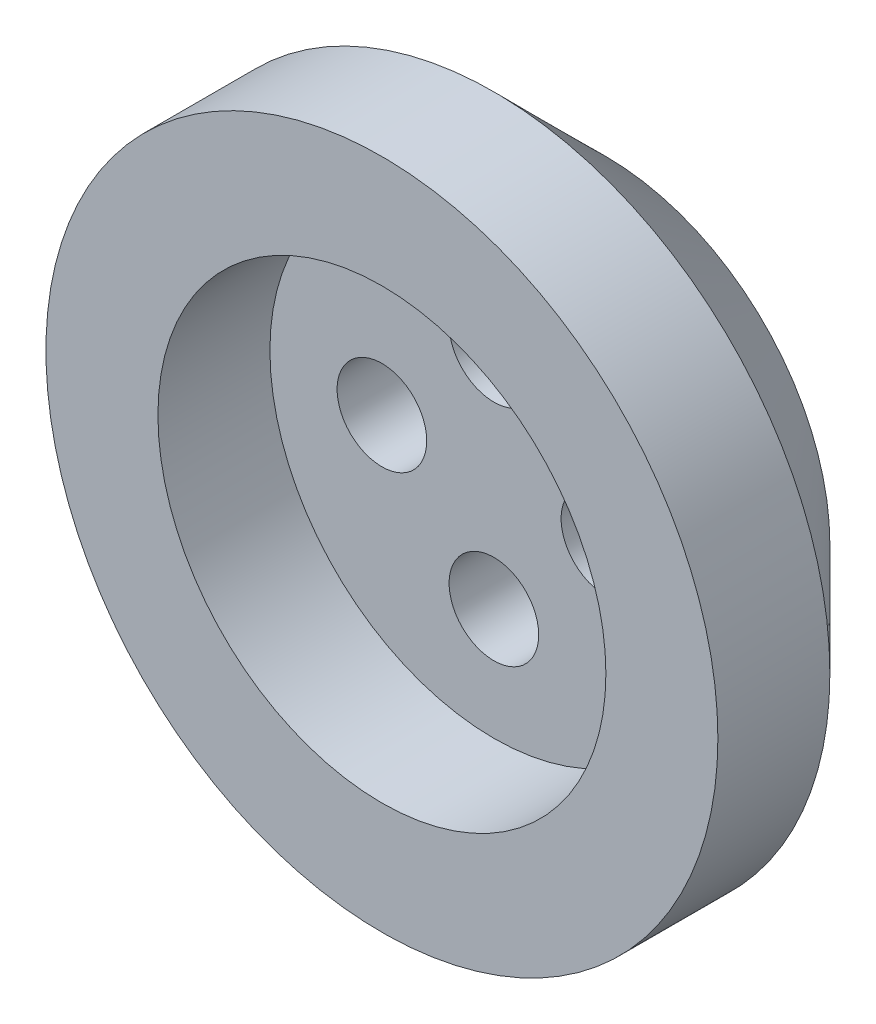
ISO-10303-21;
HEADER;
FILE_DESCRIPTION(('STEP AP214'),'2;1');
FILE_NAME('part.step','',(''),(''),'','','');
FILE_SCHEMA(('AUTOMOTIVE_DESIGN { 1 0 10303 214 1 1 1 1 }'));
ENDSEC;
DATA;
#1=APPLICATION_CONTEXT('core data for automotive mechanical design processes');
#2=APPLICATION_PROTOCOL_DEFINITION('international standard','automotive_design',2000,#1);
#3=PRODUCT_CONTEXT('',#1,'mechanical');
#4=PRODUCT('Part','Part','',(#3));
#5=PRODUCT_RELATED_PRODUCT_CATEGORY('part','',(#4));
#6=PRODUCT_DEFINITION_FORMATION('','',#4);
#7=PRODUCT_DEFINITION_CONTEXT('part definition',#1,'design');
#8=PRODUCT_DEFINITION('design','',#6,#7);
#9=PRODUCT_DEFINITION_SHAPE('','',#8);
#10=(LENGTH_UNIT() NAMED_UNIT(*) SI_UNIT(.MILLI.,.METRE.));
#11=(NAMED_UNIT(*) PLANE_ANGLE_UNIT() SI_UNIT($,.RADIAN.));
#12=(NAMED_UNIT(*) SI_UNIT($,.STERADIAN.) SOLID_ANGLE_UNIT());
#13=UNCERTAINTY_MEASURE_WITH_UNIT(LENGTH_MEASURE(1.E-05),#10,'distance_accuracy_value','');
#14=(GEOMETRIC_REPRESENTATION_CONTEXT(3) GLOBAL_UNCERTAINTY_ASSIGNED_CONTEXT((#13)) GLOBAL_UNIT_ASSIGNED_CONTEXT((#10,
#11,#12)) REPRESENTATION_CONTEXT('',''));
#15=CARTESIAN_POINT('',(0.,0.,0.));
#16=DIRECTION('',(0.,0.,1.));
#17=DIRECTION('',(1.,0.,0.));
#18=AXIS2_PLACEMENT_3D('',#15,#16,#17);
#19=CARTESIAN_POINT('',(0.,0.,5.));
#20=DIRECTION('',(0.,0.,-1.));
#21=DIRECTION('',(-1.,0.,0.));
#22=AXIS2_PLACEMENT_3D('',#19,#20,#21);
#23=CYLINDRICAL_SURFACE('',#22,7.5);
#24=CARTESIAN_POINT('',(0.,0.,2.5));
#25=DIRECTION('',(0.,0.,1.));
#26=DIRECTION('',(1.,0.,0.));
#27=AXIS2_PLACEMENT_3D('',#24,#25,#26);
#28=CIRCLE('',#27,7.5);
#29=CARTESIAN_POINT('',(7.5,0.,2.5));
#30=VERTEX_POINT('',#29);
#31=EDGE_CURVE('E48',#30,#30,#28,.T.);
#32=ORIENTED_EDGE('',*,*,#31,.T.);
#33=EDGE_LOOP('',(#32));
#34=FACE_BOUND('',#33,.T.);
#35=CARTESIAN_POINT('',(0.,0.,5.));
#36=DIRECTION('',(0.,0.,1.));
#37=DIRECTION('',(1.,0.,0.));
#38=AXIS2_PLACEMENT_3D('',#35,#36,#37);
#39=CIRCLE('',#38,7.5);
#40=CARTESIAN_POINT('',(7.5,0.,5.));
#41=VERTEX_POINT('',#40);
#42=EDGE_CURVE('E53',#41,#41,#39,.T.);
#43=ORIENTED_EDGE('',*,*,#42,.F.);
#44=EDGE_LOOP('',(#43));
#45=FACE_BOUND('',#44,.T.);
#46=ADVANCED_FACE('F39',(#34,#45),#23,.T.);
#47=CARTESIAN_POINT('',(0.,0.,5.));
#48=DIRECTION('',(0.,0.,1.));
#49=DIRECTION('',(1.,0.,0.));
#50=AXIS2_PLACEMENT_3D('',#47,#48,#49);
#51=PLANE('',#50);
#52=CARTESIAN_POINT('',(0.,0.,5.));
#53=DIRECTION('',(0.,0.,1.));
#54=DIRECTION('',(1.,0.,0.));
#55=AXIS2_PLACEMENT_3D('',#52,#53,#54);
#56=CIRCLE('',#55,5.);
#57=CARTESIAN_POINT('',(5.,0.,5.));
#58=VERTEX_POINT('',#57);
#59=EDGE_CURVE('E61',#58,#58,#56,.T.);
#60=ORIENTED_EDGE('',*,*,#59,.F.);
#61=EDGE_LOOP('',(#60));
#62=FACE_BOUND('',#61,.T.);
#63=ORIENTED_EDGE('',*,*,#42,.T.);
#64=EDGE_LOOP('',(#63));
#65=FACE_BOUND('',#64,.T.);
#66=ADVANCED_FACE('F129',(#62,#65),#51,.T.);
#67=CARTESIAN_POINT('',(0.,0.,0.));
#68=DIRECTION('',(0.,0.,1.));
#69=DIRECTION('',(1.,0.,0.));
#70=AXIS2_PLACEMENT_3D('',#67,#68,#69);
#71=PLANE('',#70);
#72=CARTESIAN_POINT('',(0.,2.5,0.));
#73=DIRECTION('',(0.,0.,1.));
#74=DIRECTION('',(1.,0.,0.));
#75=AXIS2_PLACEMENT_3D('',#72,#73,#74);
#76=CIRCLE('',#75,1.);
#77=CARTESIAN_POINT('',(1.,2.5,0.));
#78=VERTEX_POINT('',#77);
#79=EDGE_CURVE('E65',#78,#78,#76,.T.);
#80=ORIENTED_EDGE('',*,*,#79,.T.);
#81=EDGE_LOOP('',(#80));
#82=FACE_BOUND('',#81,.T.);
#83=CARTESIAN_POINT('',(2.5,0.,0.));
#84=DIRECTION('',(0.,0.,1.));
#85=DIRECTION('',(1.,0.,0.));
#86=AXIS2_PLACEMENT_3D('',#83,#84,#85);
#87=CIRCLE('',#86,1.);
#88=CARTESIAN_POINT('',(3.5,0.,0.));
#89=VERTEX_POINT('',#88);
#90=EDGE_CURVE('E89',#89,#89,#87,.T.);
#91=ORIENTED_EDGE('',*,*,#90,.T.);
#92=EDGE_LOOP('',(#91));
#93=FACE_BOUND('',#92,.T.);
#94=CARTESIAN_POINT('',(0.,-2.5,0.));
#95=DIRECTION('',(0.,0.,1.));
#96=DIRECTION('',(1.,0.,0.));
#97=AXIS2_PLACEMENT_3D('',#94,#95,#96);
#98=CIRCLE('',#97,1.);
#99=CARTESIAN_POINT('',(0.999999999999982,-2.5,0.));
#100=VERTEX_POINT('',#99);
#101=EDGE_CURVE('E81',#100,#100,#98,.T.);
#102=ORIENTED_EDGE('',*,*,#101,.T.);
#103=EDGE_LOOP('',(#102));
#104=FACE_BOUND('',#103,.T.);
#105=CARTESIAN_POINT('',(-2.5,0.,0.));
#106=DIRECTION('',(0.,0.,1.));
#107=DIRECTION('',(1.,0.,0.));
#108=AXIS2_PLACEMENT_3D('',#105,#106,#107);
#109=CIRCLE('',#108,1.);
#110=CARTESIAN_POINT('',(-1.5,0.,0.));
#111=VERTEX_POINT('',#110);
#112=EDGE_CURVE('E73',#111,#111,#109,.T.);
#113=ORIENTED_EDGE('',*,*,#112,.T.);
#114=EDGE_LOOP('',(#113));
#115=FACE_BOUND('',#114,.T.);
#116=CARTESIAN_POINT('',(0.,0.,0.));
#117=DIRECTION('',(0.,0.,1.));
#118=DIRECTION('',(1.,0.,0.));
#119=AXIS2_PLACEMENT_3D('',#116,#117,#118);
#120=CIRCLE('',#119,4.99999999999999);
#121=CARTESIAN_POINT('',(4.99999999999999,0.,0.));
#122=VERTEX_POINT('',#121);
#123=EDGE_CURVE('E10',#122,#122,#120,.F.);
#124=ORIENTED_EDGE('',*,*,#123,.T.);
#125=EDGE_LOOP('',(#124));
#126=FACE_BOUND('',#125,.T.);
#127=ADVANCED_FACE('F101',(#82,#93,#104,#115,#126),#71,.F.);
#128=CARTESIAN_POINT('',(0.,0.,2.5));
#129=DIRECTION('',(0.,0.,1.));
#130=DIRECTION('',(1.,0.,0.));
#131=AXIS2_PLACEMENT_3D('',#128,#129,#130);
#132=CYLINDRICAL_SURFACE('',#131,5.);
#133=CARTESIAN_POINT('',(0.,0.,2.5));
#134=DIRECTION('',(0.,0.,1.));
#135=DIRECTION('',(1.,0.,0.));
#136=AXIS2_PLACEMENT_3D('',#133,#134,#135);
#137=CIRCLE('',#136,5.);
#138=CARTESIAN_POINT('',(5.,0.,2.5));
#139=VERTEX_POINT('',#138);
#140=EDGE_CURVE('E58',#139,#139,#137,.T.);
#141=ORIENTED_EDGE('',*,*,#140,.F.);
#142=EDGE_LOOP('',(#141));
#143=FACE_BOUND('',#142,.T.);
#144=ORIENTED_EDGE('',*,*,#59,.T.);
#145=EDGE_LOOP('',(#144));
#146=FACE_BOUND('',#145,.T.);
#147=ADVANCED_FACE('F114',(#143,#146),#132,.F.);
#148=CARTESIAN_POINT('',(0.,0.,2.5));
#149=DIRECTION('',(0.,0.,1.));
#150=DIRECTION('',(1.,0.,0.));
#151=AXIS2_PLACEMENT_3D('',#148,#149,#150);
#152=PLANE('',#151);
#153=CARTESIAN_POINT('',(0.,2.5,2.5));
#154=DIRECTION('',(0.,0.,1.));
#155=DIRECTION('',(1.,0.,0.));
#156=AXIS2_PLACEMENT_3D('',#153,#154,#155);
#157=CIRCLE('',#156,1.);
#158=CARTESIAN_POINT('',(1.,2.5,2.5));
#159=VERTEX_POINT('',#158);
#160=EDGE_CURVE('E93',#159,#159,#157,.T.);
#161=ORIENTED_EDGE('',*,*,#160,.F.);
#162=EDGE_LOOP('',(#161));
#163=FACE_BOUND('',#162,.T.);
#164=CARTESIAN_POINT('',(2.5,0.,2.5));
#165=DIRECTION('',(0.,0.,1.));
#166=DIRECTION('',(1.,0.,0.));
#167=AXIS2_PLACEMENT_3D('',#164,#165,#166);
#168=CIRCLE('',#167,1.);
#169=CARTESIAN_POINT('',(3.5,0.,2.5));
#170=VERTEX_POINT('',#169);
#171=EDGE_CURVE('E85',#170,#170,#168,.T.);
#172=ORIENTED_EDGE('',*,*,#171,.F.);
#173=EDGE_LOOP('',(#172));
#174=FACE_BOUND('',#173,.T.);
#175=CARTESIAN_POINT('',(0.,-2.5,2.5));
#176=DIRECTION('',(0.,0.,1.));
#177=DIRECTION('',(1.,0.,0.));
#178=AXIS2_PLACEMENT_3D('',#175,#176,#177);
#179=CIRCLE('',#178,1.);
#180=CARTESIAN_POINT('',(0.999999999999982,-2.5,2.5));
#181=VERTEX_POINT('',#180);
#182=EDGE_CURVE('E77',#181,#181,#179,.T.);
#183=ORIENTED_EDGE('',*,*,#182,.F.);
#184=EDGE_LOOP('',(#183));
#185=FACE_BOUND('',#184,.T.);
#186=CARTESIAN_POINT('',(-2.5,0.,2.5));
#187=DIRECTION('',(0.,0.,1.));
#188=DIRECTION('',(1.,0.,0.));
#189=AXIS2_PLACEMENT_3D('',#186,#187,#188);
#190=CIRCLE('',#189,1.);
#191=CARTESIAN_POINT('',(-1.5,0.,2.5));
#192=VERTEX_POINT('',#191);
#193=EDGE_CURVE('E69',#192,#192,#190,.T.);
#194=ORIENTED_EDGE('',*,*,#193,.F.);
#195=EDGE_LOOP('',(#194));
#196=FACE_BOUND('',#195,.T.);
#197=ORIENTED_EDGE('',*,*,#140,.T.);
#198=EDGE_LOOP('',(#197));
#199=FACE_BOUND('',#198,.T.);
#200=ADVANCED_FACE('F111',(#163,#174,#185,#196,#199),#152,.T.);
#201=CARTESIAN_POINT('',(0.,0.,2.5));
#202=DIRECTION('',(0.,0.,1.));
#203=DIRECTION('',(1.,0.,0.));
#204=AXIS2_PLACEMENT_3D('',#201,#202,#203);
#205=CONICAL_SURFACE('',#204,7.5,0.78539816339745);
#206=ORIENTED_EDGE('',*,*,#123,.F.);
#207=EDGE_LOOP('',(#206));
#208=FACE_BOUND('',#207,.T.);
#209=ORIENTED_EDGE('',*,*,#31,.F.);
#210=EDGE_LOOP('',(#209));
#211=FACE_BOUND('',#210,.T.);
#212=ADVANCED_FACE('F42',(#208,#211),#205,.T.);
#213=CARTESIAN_POINT('',(-2.5,0.,0.));
#214=DIRECTION('',(0.,0.,1.));
#215=DIRECTION('',(1.,0.,0.));
#216=AXIS2_PLACEMENT_3D('',#213,#214,#215);
#217=CYLINDRICAL_SURFACE('',#216,1.);
#218=ORIENTED_EDGE('',*,*,#112,.F.);
#219=EDGE_LOOP('',(#218));
#220=FACE_BOUND('',#219,.T.);
#221=ORIENTED_EDGE('',*,*,#193,.T.);
#222=EDGE_LOOP('',(#221));
#223=FACE_BOUND('',#222,.T.);
#224=ADVANCED_FACE('F141',(#220,#223),#217,.F.);
#225=CARTESIAN_POINT('',(0.,-2.5,0.));
#226=DIRECTION('',(0.,0.,1.));
#227=DIRECTION('',(1.,0.,0.));
#228=AXIS2_PLACEMENT_3D('',#225,#226,#227);
#229=CYLINDRICAL_SURFACE('',#228,1.);
#230=ORIENTED_EDGE('',*,*,#101,.F.);
#231=EDGE_LOOP('',(#230));
#232=FACE_BOUND('',#231,.T.);
#233=ORIENTED_EDGE('',*,*,#182,.T.);
#234=EDGE_LOOP('',(#233));
#235=FACE_BOUND('',#234,.T.);
#236=ADVANCED_FACE('F144',(#232,#235),#229,.F.);
#237=CARTESIAN_POINT('',(2.5,0.,0.));
#238=DIRECTION('',(0.,0.,1.));
#239=DIRECTION('',(1.,0.,0.));
#240=AXIS2_PLACEMENT_3D('',#237,#238,#239);
#241=CYLINDRICAL_SURFACE('',#240,1.);
#242=ORIENTED_EDGE('',*,*,#90,.F.);
#243=EDGE_LOOP('',(#242));
#244=FACE_BOUND('',#243,.T.);
#245=ORIENTED_EDGE('',*,*,#171,.T.);
#246=EDGE_LOOP('',(#245));
#247=FACE_BOUND('',#246,.T.);
#248=ADVANCED_FACE('F107',(#244,#247),#241,.F.);
#249=CARTESIAN_POINT('',(0.,2.5,0.));
#250=DIRECTION('',(0.,0.,1.));
#251=DIRECTION('',(1.,0.,0.));
#252=AXIS2_PLACEMENT_3D('',#249,#250,#251);
#253=CYLINDRICAL_SURFACE('',#252,1.);
#254=ORIENTED_EDGE('',*,*,#79,.F.);
#255=EDGE_LOOP('',(#254));
#256=FACE_BOUND('',#255,.T.);
#257=ORIENTED_EDGE('',*,*,#160,.T.);
#258=EDGE_LOOP('',(#257));
#259=FACE_BOUND('',#258,.T.);
#260=ADVANCED_FACE('F104',(#256,#259),#253,.F.);
#261=CLOSED_SHELL('',(#46,#66,#127,#147,#200,#212,#224,#236,#248,#260));
#262=MANIFOLD_SOLID_BREP('B2',#261);
#263=ADVANCED_BREP_SHAPE_REPRESENTATION('',(#18,#262),#14);
#264=SHAPE_DEFINITION_REPRESENTATION(#9,#263);
ENDSEC;
END-ISO-10303-21;
